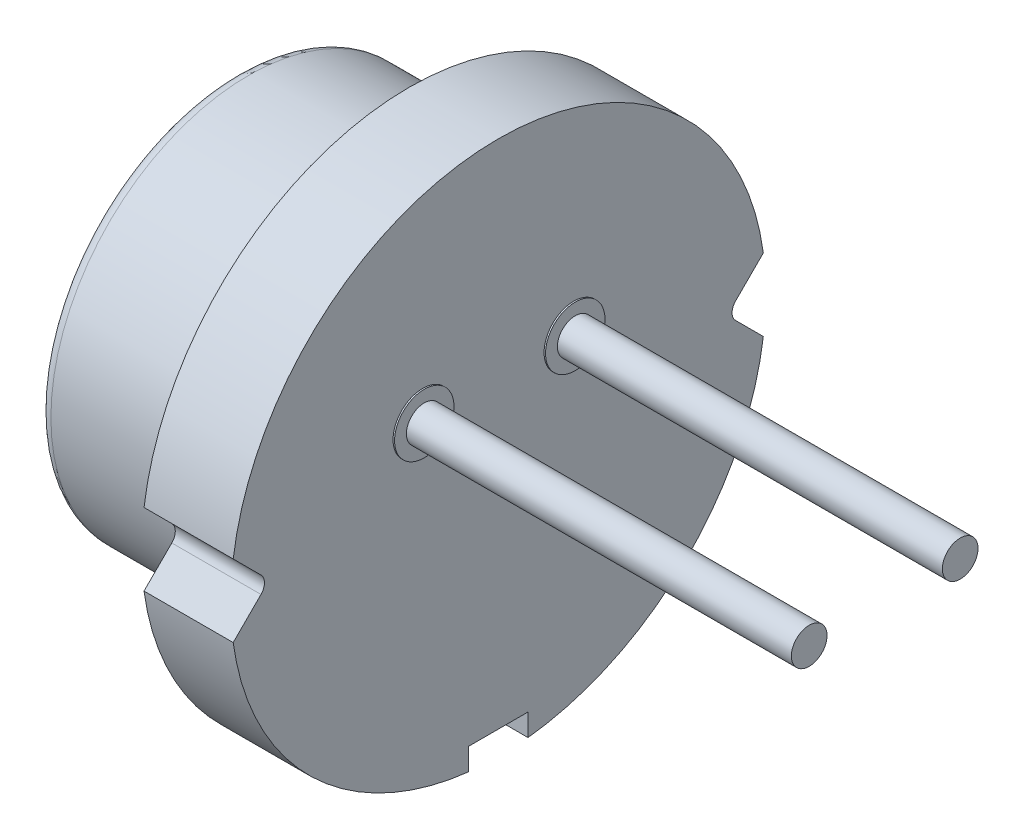
ISO-10303-21;
HEADER;
FILE_DESCRIPTION(('STEP AP214'),'2;1');
FILE_NAME('part.step','',(''),(''),'','','');
FILE_SCHEMA(('AUTOMOTIVE_DESIGN { 1 0 10303 214 1 1 1 1 }'));
ENDSEC;
DATA;
#1=APPLICATION_CONTEXT('core data for automotive mechanical design processes');
#2=APPLICATION_PROTOCOL_DEFINITION('international standard','automotive_design',2000,#1);
#3=PRODUCT_CONTEXT('',#1,'mechanical');
#4=PRODUCT('Part','Part','',(#3));
#5=PRODUCT_RELATED_PRODUCT_CATEGORY('part','',(#4));
#6=PRODUCT_DEFINITION_FORMATION('','',#4);
#7=PRODUCT_DEFINITION_CONTEXT('part definition',#1,'design');
#8=PRODUCT_DEFINITION('design','',#6,#7);
#9=PRODUCT_DEFINITION_SHAPE('','',#8);
#10=(LENGTH_UNIT() NAMED_UNIT(*) SI_UNIT(.MILLI.,.METRE.));
#11=(NAMED_UNIT(*) PLANE_ANGLE_UNIT() SI_UNIT($,.RADIAN.));
#12=(NAMED_UNIT(*) SI_UNIT($,.STERADIAN.) SOLID_ANGLE_UNIT());
#13=UNCERTAINTY_MEASURE_WITH_UNIT(LENGTH_MEASURE(1.E-05),#10,'distance_accuracy_value','');
#14=(GEOMETRIC_REPRESENTATION_CONTEXT(3) GLOBAL_UNCERTAINTY_ASSIGNED_CONTEXT((#13)) GLOBAL_UNIT_ASSIGNED_CONTEXT((#10,
#11,#12)) REPRESENTATION_CONTEXT('',''));
#15=CARTESIAN_POINT('',(0.,0.,0.));
#16=DIRECTION('',(0.,0.,1.));
#17=DIRECTION('',(1.,0.,0.));
#18=AXIS2_PLACEMENT_3D('',#15,#16,#17);
#19=CARTESIAN_POINT('',(-0.46,0.,-0.5));
#20=DIRECTION('',(0.,0.,-1.));
#21=DIRECTION('',(-1.,0.,0.));
#22=AXIS2_PLACEMENT_3D('',#19,#20,#21);
#23=PLANE('',#22);
#24=DIRECTION('',(0.,-1.,0.));
#25=VECTOR('',#24,1.);
#26=CARTESIAN_POINT('',(-1.96,0.,-0.5));
#27=LINE('',#26,#25);
#28=CARTESIAN_POINT('',(-1.96,0.,-0.5));
#29=VERTEX_POINT('',#28);
#30=CARTESIAN_POINT('',(-1.96,-0.1,-0.5));
#31=VERTEX_POINT('',#30);
#32=EDGE_CURVE('E109',#29,#31,#27,.T.);
#33=ORIENTED_EDGE('',*,*,#32,.F.);
#34=DIRECTION('',(-1.,0.,0.));
#35=VECTOR('',#34,1.);
#36=CARTESIAN_POINT('',(-0.46,0.,-0.5));
#37=LINE('',#36,#35);
#38=CARTESIAN_POINT('',(-0.46,0.,-0.5));
#39=VERTEX_POINT('',#38);
#40=EDGE_CURVE('E12',#39,#29,#37,.T.);
#41=ORIENTED_EDGE('',*,*,#40,.F.);
#42=DIRECTION('',(0.,-1.,0.));
#43=VECTOR('',#42,1.);
#44=CARTESIAN_POINT('',(-0.46,0.,-0.5));
#45=LINE('',#44,#43);
#46=CARTESIAN_POINT('',(-0.46,-0.1,-0.5));
#47=VERTEX_POINT('',#46);
#48=EDGE_CURVE('E103',#39,#47,#45,.T.);
#49=ORIENTED_EDGE('',*,*,#48,.T.);
#50=DIRECTION('',(-1.,0.,0.));
#51=VECTOR('',#50,1.);
#52=CARTESIAN_POINT('',(-0.46,-0.1,-0.5));
#53=LINE('',#52,#51);
#54=EDGE_CURVE('E48',#47,#31,#53,.T.);
#55=ORIENTED_EDGE('',*,*,#54,.T.);
#56=EDGE_LOOP('',(#33,#41,#49,#55));
#57=FACE_BOUND('',#56,.T.);
#58=ADVANCED_FACE('F45',(#57),#23,.T.);
#59=CARTESIAN_POINT('',(-0.46,0.,-0.5));
#60=DIRECTION('',(0.,1.,0.));
#61=DIRECTION('',(0.,0.,1.));
#62=AXIS2_PLACEMENT_3D('',#59,#60,#61);
#63=PLANE('',#62);
#64=DIRECTION('',(0.,0.,-1.));
#65=VECTOR('',#64,1.);
#66=CARTESIAN_POINT('',(-1.96,0.,-0.5));
#67=LINE('',#66,#65);
#68=CARTESIAN_POINT('',(-1.96,0.,0.5));
#69=VERTEX_POINT('',#68);
#70=EDGE_CURVE('E105',#69,#29,#67,.T.);
#71=ORIENTED_EDGE('',*,*,#70,.F.);
#72=DIRECTION('',(-1.,0.,0.));
#73=VECTOR('',#72,1.);
#74=CARTESIAN_POINT('',(-0.46,0.,0.5));
#75=LINE('',#74,#73);
#76=CARTESIAN_POINT('',(-0.46,0.,0.5));
#77=VERTEX_POINT('',#76);
#78=EDGE_CURVE('E54',#77,#69,#75,.T.);
#79=ORIENTED_EDGE('',*,*,#78,.F.);
#80=DIRECTION('',(0.,0.,-1.));
#81=VECTOR('',#80,1.);
#82=CARTESIAN_POINT('',(-0.46,0.,-0.5));
#83=LINE('',#82,#81);
#84=EDGE_CURVE('E100',#77,#39,#83,.T.);
#85=ORIENTED_EDGE('',*,*,#84,.T.);
#86=ORIENTED_EDGE('',*,*,#40,.T.);
#87=EDGE_LOOP('',(#71,#79,#85,#86));
#88=FACE_BOUND('',#87,.T.);
#89=ADVANCED_FACE('F119',(#88),#63,.T.);
#90=CARTESIAN_POINT('',(-0.46,0.,0.5));
#91=DIRECTION('',(0.,0.,1.));
#92=DIRECTION('',(1.,0.,0.));
#93=AXIS2_PLACEMENT_3D('',#90,#91,#92);
#94=PLANE('',#93);
#95=DIRECTION('',(0.,1.,0.));
#96=VECTOR('',#95,1.);
#97=CARTESIAN_POINT('',(-1.96,0.,0.5));
#98=LINE('',#97,#96);
#99=CARTESIAN_POINT('',(-1.96,-0.1,0.5));
#100=VERTEX_POINT('',#99);
#101=EDGE_CURVE('E95',#100,#69,#98,.T.);
#102=ORIENTED_EDGE('',*,*,#101,.F.);
#103=DIRECTION('',(-1.,0.,0.));
#104=VECTOR('',#103,1.);
#105=CARTESIAN_POINT('',(-0.46,-0.1,0.5));
#106=LINE('',#105,#104);
#107=CARTESIAN_POINT('',(-0.46,-0.1,0.5));
#108=VERTEX_POINT('',#107);
#109=EDGE_CURVE('E90',#108,#100,#106,.T.);
#110=ORIENTED_EDGE('',*,*,#109,.F.);
#111=DIRECTION('',(0.,1.,0.));
#112=VECTOR('',#111,1.);
#113=CARTESIAN_POINT('',(-0.46,0.,0.5));
#114=LINE('',#113,#112);
#115=EDGE_CURVE('E93',#108,#77,#114,.T.);
#116=ORIENTED_EDGE('',*,*,#115,.T.);
#117=ORIENTED_EDGE('',*,*,#78,.T.);
#118=EDGE_LOOP('',(#102,#110,#116,#117));
#119=FACE_BOUND('',#118,.T.);
#120=ADVANCED_FACE('F92',(#119),#94,.T.);
#121=CARTESIAN_POINT('',(-0.46,-0.1,0.5));
#122=DIRECTION('',(0.,-1.,0.));
#123=DIRECTION('',(0.,0.,-1.));
#124=AXIS2_PLACEMENT_3D('',#121,#122,#123);
#125=PLANE('',#124);
#126=DIRECTION('',(0.,0.,1.));
#127=VECTOR('',#126,1.);
#128=CARTESIAN_POINT('',(-1.96,-0.1,0.5));
#129=LINE('',#128,#127);
#130=EDGE_CURVE('E112',#31,#100,#129,.T.);
#131=ORIENTED_EDGE('',*,*,#130,.F.);
#132=ORIENTED_EDGE('',*,*,#54,.F.);
#133=DIRECTION('',(0.,0.,1.));
#134=VECTOR('',#133,1.);
#135=CARTESIAN_POINT('',(-0.46,-0.1,0.5));
#136=LINE('',#135,#134);
#137=EDGE_CURVE('E99',#47,#108,#136,.T.);
#138=ORIENTED_EDGE('',*,*,#137,.T.);
#139=ORIENTED_EDGE('',*,*,#109,.T.);
#140=EDGE_LOOP('',(#131,#132,#138,#139));
#141=FACE_BOUND('',#140,.T.);
#142=ADVANCED_FACE('F102',(#141),#125,.T.);
#143=CARTESIAN_POINT('',(-0.46,0.,0.));
#144=DIRECTION('',(1.,0.,0.));
#145=DIRECTION('',(0.,0.,-1.));
#146=AXIS2_PLACEMENT_3D('',#143,#144,#145);
#147=PLANE('',#146);
#148=ORIENTED_EDGE('',*,*,#48,.F.);
#149=ORIENTED_EDGE('',*,*,#84,.F.);
#150=ORIENTED_EDGE('',*,*,#115,.F.);
#151=ORIENTED_EDGE('',*,*,#137,.F.);
#152=EDGE_LOOP('',(#148,#149,#150,#151));
#153=FACE_BOUND('',#152,.T.);
#154=ADVANCED_FACE('F98',(#153),#147,.T.);
#155=CARTESIAN_POINT('',(-1.96,0.,0.));
#156=DIRECTION('',(1.,0.,0.));
#157=DIRECTION('',(0.,0.,-1.));
#158=AXIS2_PLACEMENT_3D('',#155,#156,#157);
#159=PLANE('',#158);
#160=ORIENTED_EDGE('',*,*,#32,.T.);
#161=ORIENTED_EDGE('',*,*,#130,.T.);
#162=ORIENTED_EDGE('',*,*,#101,.T.);
#163=ORIENTED_EDGE('',*,*,#70,.T.);
#164=EDGE_LOOP('',(#160,#161,#162,#163));
#165=FACE_BOUND('',#164,.T.);
#166=ADVANCED_FACE('F118',(#165),#159,.F.);
#167=CLOSED_SHELL('',(#58,#89,#120,#142,#154,#166));
#168=MANIFOLD_SOLID_BREP('B2',#167);
#169=CARTESIAN_POINT('',(1.475,1.,-1.27));
#170=DIRECTION('',(1.,0.,0.));
#171=DIRECTION('',(0.,0.,-1.));
#172=AXIS2_PLACEMENT_3D('',#169,#170,#171);
#173=CYLINDRICAL_SURFACE('',#172,0.5);
#174=CARTESIAN_POINT('',(1.475,1.,-1.27));
#175=DIRECTION('',(1.,0.,0.));
#176=DIRECTION('',(0.,0.,-1.));
#177=AXIS2_PLACEMENT_3D('',#174,#175,#176);
#178=CIRCLE('',#177,0.5);
#179=CARTESIAN_POINT('',(1.475,1.,-1.77));
#180=VERTEX_POINT('',#179);
#181=EDGE_CURVE('E44',#180,#180,#178,.T.);
#182=ORIENTED_EDGE('',*,*,#181,.T.);
#183=EDGE_LOOP('',(#182));
#184=FACE_BOUND('',#183,.T.);
#185=CARTESIAN_POINT('',(1.525,1.,-1.27));
#186=DIRECTION('',(1.,0.,0.));
#187=DIRECTION('',(0.,0.,-1.));
#188=AXIS2_PLACEMENT_3D('',#185,#186,#187);
#189=CIRCLE('',#188,0.5);
#190=CARTESIAN_POINT('',(1.525,1.,-1.77));
#191=VERTEX_POINT('',#190);
#192=EDGE_CURVE('E179',#191,#191,#189,.T.);
#193=ORIENTED_EDGE('',*,*,#192,.F.);
#194=EDGE_LOOP('',(#193));
#195=FACE_BOUND('',#194,.T.);
#196=ADVANCED_FACE('F176',(#184,#195),#173,.T.);
#197=CARTESIAN_POINT('',(1.475,1.,-1.27));
#198=DIRECTION('',(1.,0.,0.));
#199=DIRECTION('',(0.,0.,-1.));
#200=AXIS2_PLACEMENT_3D('',#197,#198,#199);
#201=PLANE('',#200);
#202=CARTESIAN_POINT('',(1.475,1.,-1.27));
#203=DIRECTION('',(1.,0.,0.));
#204=DIRECTION('',(0.,0.,-1.));
#205=AXIS2_PLACEMENT_3D('',#202,#203,#204);
#206=CIRCLE('',#205,0.3);
#207=CARTESIAN_POINT('',(1.475,1.,-1.57));
#208=VERTEX_POINT('',#207);
#209=EDGE_CURVE('E186',#208,#208,#206,.T.);
#210=ORIENTED_EDGE('',*,*,#209,.T.);
#211=EDGE_LOOP('',(#210));
#212=FACE_BOUND('',#211,.T.);
#213=ORIENTED_EDGE('',*,*,#181,.F.);
#214=EDGE_LOOP('',(#213));
#215=FACE_BOUND('',#214,.T.);
#216=ADVANCED_FACE('F194',(#212,#215),#201,.F.);
#217=CARTESIAN_POINT('',(1.525,1.,-1.27));
#218=DIRECTION('',(1.,0.,0.));
#219=DIRECTION('',(0.,0.,-1.));
#220=AXIS2_PLACEMENT_3D('',#217,#218,#219);
#221=PLANE('',#220);
#222=CARTESIAN_POINT('',(1.525,1.,-1.27));
#223=DIRECTION('',(1.,0.,0.));
#224=DIRECTION('',(0.,0.,-1.));
#225=AXIS2_PLACEMENT_3D('',#222,#223,#224);
#226=CIRCLE('',#225,0.3);
#227=CARTESIAN_POINT('',(1.525,1.,-1.57));
#228=VERTEX_POINT('',#227);
#229=EDGE_CURVE('E188',#228,#228,#226,.T.);
#230=ORIENTED_EDGE('',*,*,#229,.F.);
#231=EDGE_LOOP('',(#230));
#232=FACE_BOUND('',#231,.T.);
#233=ORIENTED_EDGE('',*,*,#192,.T.);
#234=EDGE_LOOP('',(#233));
#235=FACE_BOUND('',#234,.T.);
#236=ADVANCED_FACE('F200',(#232,#235),#221,.T.);
#237=CARTESIAN_POINT('',(1.475,1.,-1.27));
#238=DIRECTION('',(1.,0.,0.));
#239=DIRECTION('',(0.,0.,-1.));
#240=AXIS2_PLACEMENT_3D('',#237,#238,#239);
#241=CYLINDRICAL_SURFACE('',#240,0.3);
#242=ORIENTED_EDGE('',*,*,#209,.F.);
#243=EDGE_LOOP('',(#242));
#244=FACE_BOUND('',#243,.T.);
#245=ORIENTED_EDGE('',*,*,#229,.T.);
#246=EDGE_LOOP('',(#245));
#247=FACE_BOUND('',#246,.T.);
#248=ADVANCED_FACE('F197',(#244,#247),#241,.F.);
#249=CLOSED_SHELL('',(#196,#216,#236,#248));
#250=MANIFOLD_SOLID_BREP('B6',#249);
#251=CARTESIAN_POINT('',(1.475,1.,1.27));
#252=DIRECTION('',(1.,0.,0.));
#253=DIRECTION('',(0.,0.,-1.));
#254=AXIS2_PLACEMENT_3D('',#251,#252,#253);
#255=CYLINDRICAL_SURFACE('',#254,0.5);
#256=CARTESIAN_POINT('',(1.475,1.,1.27));
#257=DIRECTION('',(1.,0.,0.));
#258=DIRECTION('',(0.,0.,-1.));
#259=AXIS2_PLACEMENT_3D('',#256,#257,#258);
#260=CIRCLE('',#259,0.5);
#261=CARTESIAN_POINT('',(1.475,1.,0.77));
#262=VERTEX_POINT('',#261);
#263=EDGE_CURVE('E175',#262,#262,#260,.T.);
#264=ORIENTED_EDGE('',*,*,#263,.T.);
#265=EDGE_LOOP('',(#264));
#266=FACE_BOUND('',#265,.T.);
#267=CARTESIAN_POINT('',(1.525,1.,1.27));
#268=DIRECTION('',(1.,0.,0.));
#269=DIRECTION('',(0.,0.,-1.));
#270=AXIS2_PLACEMENT_3D('',#267,#268,#269);
#271=CIRCLE('',#270,0.5);
#272=CARTESIAN_POINT('',(1.525,1.,0.77));
#273=VERTEX_POINT('',#272);
#274=EDGE_CURVE('E248',#273,#273,#271,.T.);
#275=ORIENTED_EDGE('',*,*,#274,.F.);
#276=EDGE_LOOP('',(#275));
#277=FACE_BOUND('',#276,.T.);
#278=ADVANCED_FACE('F245',(#266,#277),#255,.T.);
#279=CARTESIAN_POINT('',(1.475,1.,1.27));
#280=DIRECTION('',(1.,0.,0.));
#281=DIRECTION('',(0.,0.,-1.));
#282=AXIS2_PLACEMENT_3D('',#279,#280,#281);
#283=PLANE('',#282);
#284=CARTESIAN_POINT('',(1.475,1.,1.27));
#285=DIRECTION('',(1.,0.,0.));
#286=DIRECTION('',(0.,0.,-1.));
#287=AXIS2_PLACEMENT_3D('',#284,#285,#286);
#288=CIRCLE('',#287,0.3);
#289=CARTESIAN_POINT('',(1.475,1.,0.97));
#290=VERTEX_POINT('',#289);
#291=EDGE_CURVE('E255',#290,#290,#288,.T.);
#292=ORIENTED_EDGE('',*,*,#291,.T.);
#293=EDGE_LOOP('',(#292));
#294=FACE_BOUND('',#293,.T.);
#295=ORIENTED_EDGE('',*,*,#263,.F.);
#296=EDGE_LOOP('',(#295));
#297=FACE_BOUND('',#296,.T.);
#298=ADVANCED_FACE('F263',(#294,#297),#283,.F.);
#299=CARTESIAN_POINT('',(1.525,1.,1.27));
#300=DIRECTION('',(1.,0.,0.));
#301=DIRECTION('',(0.,0.,-1.));
#302=AXIS2_PLACEMENT_3D('',#299,#300,#301);
#303=PLANE('',#302);
#304=CARTESIAN_POINT('',(1.525,1.,1.27));
#305=DIRECTION('',(1.,0.,0.));
#306=DIRECTION('',(0.,0.,-1.));
#307=AXIS2_PLACEMENT_3D('',#304,#305,#306);
#308=CIRCLE('',#307,0.3);
#309=CARTESIAN_POINT('',(1.525,1.,0.97));
#310=VERTEX_POINT('',#309);
#311=EDGE_CURVE('E257',#310,#310,#308,.T.);
#312=ORIENTED_EDGE('',*,*,#311,.F.);
#313=EDGE_LOOP('',(#312));
#314=FACE_BOUND('',#313,.T.);
#315=ORIENTED_EDGE('',*,*,#274,.T.);
#316=EDGE_LOOP('',(#315));
#317=FACE_BOUND('',#316,.T.);
#318=ADVANCED_FACE('F269',(#314,#317),#303,.T.);
#319=CARTESIAN_POINT('',(1.475,1.,1.27));
#320=DIRECTION('',(1.,0.,0.));
#321=DIRECTION('',(0.,0.,-1.));
#322=AXIS2_PLACEMENT_3D('',#319,#320,#321);
#323=CYLINDRICAL_SURFACE('',#322,0.3);
#324=ORIENTED_EDGE('',*,*,#291,.F.);
#325=EDGE_LOOP('',(#324));
#326=FACE_BOUND('',#325,.T.);
#327=ORIENTED_EDGE('',*,*,#311,.T.);
#328=EDGE_LOOP('',(#327));
#329=FACE_BOUND('',#328,.T.);
#330=ADVANCED_FACE('F266',(#326,#329),#323,.F.);
#331=CLOSED_SHELL('',(#278,#298,#318,#330));
#332=MANIFOLD_SOLID_BREP('B39',#331);
#333=CARTESIAN_POINT('',(-2.49171245983604,0.,0.));
#334=DIRECTION('',(-1.,0.,0.));
#335=DIRECTION('',(0.,0.,1.));
#336=AXIS2_PLACEMENT_3D('',#333,#334,#335);
#337=CYLINDRICAL_SURFACE('',#336,3.125);
#338=CARTESIAN_POINT('',(-0.541893017764334,0.,0.));
#339=DIRECTION('',(-1.,0.,0.));
#340=DIRECTION('',(0.,0.,1.));
#341=AXIS2_PLACEMENT_3D('',#338,#339,#340);
#342=CIRCLE('',#341,3.125);
#343=CARTESIAN_POINT('',(-0.541893017764334,0.,3.125));
#344=VERTEX_POINT('',#343);
#345=EDGE_CURVE('E326',#344,#344,#342,.T.);
#346=ORIENTED_EDGE('',*,*,#345,.F.);
#347=EDGE_LOOP('',(#346));
#348=FACE_BOUND('',#347,.T.);
#349=CARTESIAN_POINT('',(-2.7,0.,0.));
#350=DIRECTION('',(-1.,0.,0.));
#351=DIRECTION('',(0.,0.,1.));
#352=AXIS2_PLACEMENT_3D('',#349,#350,#351);
#353=CIRCLE('',#352,3.125);
#354=CARTESIAN_POINT('',(-2.7,0.,3.125));
#355=VERTEX_POINT('',#354);
#356=EDGE_CURVE('E356',#355,#355,#353,.T.);
#357=ORIENTED_EDGE('',*,*,#356,.T.);
#358=EDGE_LOOP('',(#357));
#359=FACE_BOUND('',#358,.T.);
#360=ADVANCED_FACE('F315',(#348,#359),#337,.F.);
#361=CARTESIAN_POINT('',(-0.541893017764335,0.,0.));
#362=DIRECTION('',(-1.,0.,0.));
#363=DIRECTION('',(0.,0.,1.));
#364=AXIS2_PLACEMENT_3D('',#361,#362,#363);
#365=TOROIDAL_SURFACE('',#364,3.90466681152649,0.779666811526495);
#366=CARTESIAN_POINT('',(-0.0275652351110064,0.,0.));
#367=DIRECTION('',(-1.,0.,0.));
#368=DIRECTION('',(0.,0.,1.));
#369=AXIS2_PLACEMENT_3D('',#366,#367,#368);
#370=CIRCLE('',#369,3.31870839236452);
#371=CARTESIAN_POINT('',(-0.0275652351110064,0.,3.31870839236452));
#372=VERTEX_POINT('',#371);
#373=EDGE_CURVE('E330',#372,#372,#370,.T.);
#374=ORIENTED_EDGE('',*,*,#373,.F.);
#375=EDGE_LOOP('',(#374));
#376=FACE_BOUND('',#375,.T.);
#377=ORIENTED_EDGE('',*,*,#345,.T.);
#378=EDGE_LOOP('',(#377));
#379=FACE_BOUND('',#378,.T.);
#380=ADVANCED_FACE('F383',(#376,#379),#365,.T.);
#381=CARTESIAN_POINT('',(-2.49171245983604,0.,0.));
#382=DIRECTION('',(-1.,0.,0.));
#383=DIRECTION('',(0.,0.,1.));
#384=AXIS2_PLACEMENT_3D('',#381,#382,#383);
#385=CYLINDRICAL_SURFACE('',#384,3.31870839236452);
#386=CARTESIAN_POINT('',(0.,0.,0.));
#387=DIRECTION('',(-1.,0.,0.));
#388=DIRECTION('',(0.,0.,1.));
#389=AXIS2_PLACEMENT_3D('',#386,#387,#388);
#390=CIRCLE('',#389,3.31870839236452);
#391=CARTESIAN_POINT('',(0.,0.,3.31870839236452));
#392=VERTEX_POINT('',#391);
#393=EDGE_CURVE('E335',#392,#392,#390,.T.);
#394=ORIENTED_EDGE('',*,*,#393,.F.);
#395=EDGE_LOOP('',(#394));
#396=FACE_BOUND('',#395,.T.);
#397=ORIENTED_EDGE('',*,*,#373,.T.);
#398=EDGE_LOOP('',(#397));
#399=FACE_BOUND('',#398,.T.);
#400=ADVANCED_FACE('F388',(#396,#399),#385,.F.);
#401=CARTESIAN_POINT('',(0.,0.,0.));
#402=DIRECTION('',(1.,0.,0.));
#403=DIRECTION('',(0.,0.,-1.));
#404=AXIS2_PLACEMENT_3D('',#401,#402,#403);
#405=PLANE('',#404);
#406=ORIENTED_EDGE('',*,*,#393,.T.);
#407=EDGE_LOOP('',(#406));
#408=FACE_BOUND('',#407,.T.);
#409=CARTESIAN_POINT('',(0.,0.,0.));
#410=DIRECTION('',(-1.,0.,0.));
#411=DIRECTION('',(0.,0.,1.));
#412=AXIS2_PLACEMENT_3D('',#409,#410,#411);
#413=CIRCLE('',#412,3.65);
#414=CARTESIAN_POINT('',(0.,0.,3.65));
#415=VERTEX_POINT('',#414);
#416=EDGE_CURVE('E338',#415,#415,#413,.T.);
#417=ORIENTED_EDGE('',*,*,#416,.F.);
#418=EDGE_LOOP('',(#417));
#419=FACE_BOUND('',#418,.T.);
#420=ADVANCED_FACE('F395',(#408,#419),#405,.T.);
#421=CARTESIAN_POINT('',(-2.49171245983604,0.,0.));
#422=DIRECTION('',(-1.,0.,0.));
#423=DIRECTION('',(0.,0.,1.));
#424=AXIS2_PLACEMENT_3D('',#421,#422,#423);
#425=CYLINDRICAL_SURFACE('',#424,3.65);
#426=CARTESIAN_POINT('',(-0.200000000000001,0.,0.));
#427=DIRECTION('',(-1.,0.,0.));
#428=DIRECTION('',(0.,0.,1.));
#429=AXIS2_PLACEMENT_3D('',#426,#427,#428);
#430=CIRCLE('',#429,3.65);
#431=CARTESIAN_POINT('',(-0.200000000000001,0.,3.65));
#432=VERTEX_POINT('',#431);
#433=EDGE_CURVE('E341',#432,#432,#430,.T.);
#434=ORIENTED_EDGE('',*,*,#433,.F.);
#435=EDGE_LOOP('',(#434));
#436=FACE_BOUND('',#435,.T.);
#437=ORIENTED_EDGE('',*,*,#416,.T.);
#438=EDGE_LOOP('',(#437));
#439=FACE_BOUND('',#438,.T.);
#440=ADVANCED_FACE('F399',(#436,#439),#425,.T.);
#441=CARTESIAN_POINT('',(-0.200000000000001,0.,0.));
#442=DIRECTION('',(1.,0.,0.));
#443=DIRECTION('',(0.,0.,-1.));
#444=AXIS2_PLACEMENT_3D('',#441,#442,#443);
#445=PLANE('',#444);
#446=CARTESIAN_POINT('',(-0.200000000000001,0.,0.));
#447=DIRECTION('',(-1.,0.,0.));
#448=DIRECTION('',(0.,0.,1.));
#449=AXIS2_PLACEMENT_3D('',#446,#447,#448);
#450=CIRCLE('',#449,3.575);
#451=CARTESIAN_POINT('',(-0.200000000000001,0.,3.575));
#452=VERTEX_POINT('',#451);
#453=EDGE_CURVE('E344',#452,#452,#450,.T.);
#454=ORIENTED_EDGE('',*,*,#453,.F.);
#455=EDGE_LOOP('',(#454));
#456=FACE_BOUND('',#455,.T.);
#457=ORIENTED_EDGE('',*,*,#433,.T.);
#458=EDGE_LOOP('',(#457));
#459=FACE_BOUND('',#458,.T.);
#460=ADVANCED_FACE('F403',(#456,#459),#445,.F.);
#461=CARTESIAN_POINT('',(-0.450000000000001,0.,0.));
#462=DIRECTION('',(-1.,0.,0.));
#463=DIRECTION('',(0.,0.,1.));
#464=AXIS2_PLACEMENT_3D('',#461,#462,#463);
#465=TOROIDAL_SURFACE('',#464,3.575,0.25);
#466=CARTESIAN_POINT('',(-0.450000000000001,0.,0.));
#467=DIRECTION('',(-1.,0.,0.));
#468=DIRECTION('',(0.,0.,1.));
#469=AXIS2_PLACEMENT_3D('',#466,#467,#468);
#470=CIRCLE('',#469,3.325);
#471=CARTESIAN_POINT('',(-0.450000000000001,0.,3.325));
#472=VERTEX_POINT('',#471);
#473=EDGE_CURVE('E347',#472,#472,#470,.T.);
#474=ORIENTED_EDGE('',*,*,#473,.F.);
#475=EDGE_LOOP('',(#474));
#476=FACE_BOUND('',#475,.T.);
#477=ORIENTED_EDGE('',*,*,#453,.T.);
#478=EDGE_LOOP('',(#477));
#479=FACE_BOUND('',#478,.T.);
#480=ADVANCED_FACE('F380',(#476,#479),#465,.F.);
#481=CARTESIAN_POINT('',(-2.49171245983604,0.,0.));
#482=DIRECTION('',(-1.,0.,0.));
#483=DIRECTION('',(0.,0.,1.));
#484=AXIS2_PLACEMENT_3D('',#481,#482,#483);
#485=CYLINDRICAL_SURFACE('',#484,3.325);
#486=CARTESIAN_POINT('',(-2.7,0.,0.));
#487=DIRECTION('',(-1.,0.,0.));
#488=DIRECTION('',(0.,0.,1.));
#489=AXIS2_PLACEMENT_3D('',#486,#487,#488);
#490=CIRCLE('',#489,3.325);
#491=CARTESIAN_POINT('',(-2.7,0.,3.325));
#492=VERTEX_POINT('',#491);
#493=EDGE_CURVE('E244',#492,#492,#490,.F.);
#494=ORIENTED_EDGE('',*,*,#493,.T.);
#495=EDGE_LOOP('',(#494));
#496=FACE_BOUND('',#495,.T.);
#497=ORIENTED_EDGE('',*,*,#473,.T.);
#498=EDGE_LOOP('',(#497));
#499=FACE_BOUND('',#498,.T.);
#500=ADVANCED_FACE('F375',(#496,#499),#485,.T.);
#501=CARTESIAN_POINT('',(-2.9,0.,0.));
#502=DIRECTION('',(-1.,0.,0.));
#503=DIRECTION('',(0.,0.,1.));
#504=AXIS2_PLACEMENT_3D('',#501,#502,#503);
#505=PLANE('',#504);
#506=CARTESIAN_POINT('',(-2.9,0.,0.));
#507=DIRECTION('',(-1.,0.,0.));
#508=DIRECTION('',(0.,0.,1.));
#509=AXIS2_PLACEMENT_3D('',#506,#507,#508);
#510=CIRCLE('',#509,3.125);
#511=CARTESIAN_POINT('',(-2.9,0.,3.125));
#512=VERTEX_POINT('',#511);
#513=EDGE_CURVE('E322',#512,#512,#510,.T.);
#514=ORIENTED_EDGE('',*,*,#513,.T.);
#515=EDGE_LOOP('',(#514));
#516=FACE_BOUND('',#515,.T.);
#517=CARTESIAN_POINT('',(-2.9,0.,0.));
#518=DIRECTION('',(-1.,0.,0.));
#519=DIRECTION('',(0.,0.,1.));
#520=AXIS2_PLACEMENT_3D('',#517,#518,#519);
#521=CIRCLE('',#520,0.75);
#522=CARTESIAN_POINT('',(-2.9,0.,0.75));
#523=VERTEX_POINT('',#522);
#524=EDGE_CURVE('E350',#523,#523,#521,.T.);
#525=ORIENTED_EDGE('',*,*,#524,.F.);
#526=EDGE_LOOP('',(#525));
#527=FACE_BOUND('',#526,.T.);
#528=ADVANCED_FACE('F370',(#516,#527),#505,.T.);
#529=CARTESIAN_POINT('',(-2.49171245983604,0.,0.));
#530=DIRECTION('',(-1.,0.,0.));
#531=DIRECTION('',(0.,0.,1.));
#532=AXIS2_PLACEMENT_3D('',#529,#530,#531);
#533=CYLINDRICAL_SURFACE('',#532,0.75);
#534=CARTESIAN_POINT('',(-2.7,0.,0.));
#535=DIRECTION('',(-1.,0.,0.));
#536=DIRECTION('',(0.,0.,1.));
#537=AXIS2_PLACEMENT_3D('',#534,#535,#536);
#538=CIRCLE('',#537,0.75);
#539=CARTESIAN_POINT('',(-2.7,0.,0.75));
#540=VERTEX_POINT('',#539);
#541=EDGE_CURVE('E353',#540,#540,#538,.T.);
#542=ORIENTED_EDGE('',*,*,#541,.F.);
#543=EDGE_LOOP('',(#542));
#544=FACE_BOUND('',#543,.T.);
#545=ORIENTED_EDGE('',*,*,#524,.T.);
#546=EDGE_LOOP('',(#545));
#547=FACE_BOUND('',#546,.T.);
#548=ADVANCED_FACE('F364',(#544,#547),#533,.F.);
#549=CARTESIAN_POINT('',(-2.7,0.,0.));
#550=DIRECTION('',(-1.,0.,0.));
#551=DIRECTION('',(0.,0.,1.));
#552=AXIS2_PLACEMENT_3D('',#549,#550,#551);
#553=PLANE('',#552);
#554=ORIENTED_EDGE('',*,*,#356,.F.);
#555=EDGE_LOOP('',(#554));
#556=FACE_BOUND('',#555,.T.);
#557=ORIENTED_EDGE('',*,*,#541,.T.);
#558=EDGE_LOOP('',(#557));
#559=FACE_BOUND('',#558,.T.);
#560=ADVANCED_FACE('F361',(#556,#559),#553,.F.);
#561=CARTESIAN_POINT('',(-2.7,0.,0.));
#562=DIRECTION('',(-1.,0.,0.));
#563=DIRECTION('',(0.,0.,1.));
#564=AXIS2_PLACEMENT_3D('',#561,#562,#563);
#565=TOROIDAL_SURFACE('',#564,3.125,0.2);
#566=ORIENTED_EDGE('',*,*,#493,.F.);
#567=EDGE_LOOP('',(#566));
#568=FACE_BOUND('',#567,.T.);
#569=ORIENTED_EDGE('',*,*,#513,.F.);
#570=EDGE_LOOP('',(#569));
#571=FACE_BOUND('',#570,.T.);
#572=ADVANCED_FACE('F317',(#568,#571),#565,.T.);
#573=CLOSED_SHELL('',(#360,#380,#400,#420,#440,#460,#480,#500,#528,#548,#560,#572));
#574=MANIFOLD_SOLID_BREP('B170',#573);
#575=CARTESIAN_POINT('',(0.,0.,0.));
#576=DIRECTION('',(1.,0.,0.));
#577=DIRECTION('',(0.,0.,-1.));
#578=AXIS2_PLACEMENT_3D('',#575,#576,#577);
#579=PLANE('',#578);
#580=DIRECTION('',(0.,1.,0.));
#581=VECTOR('',#580,1.);
#582=CARTESIAN_POINT('',(0.,-0.1,2.22715627668659));
#583=LINE('',#582,#581);
#584=CARTESIAN_POINT('',(0.,-1.95888908740472,2.22715627668659));
#585=VERTEX_POINT('',#584);
#586=CARTESIAN_POINT('',(0.,-0.1,2.22715627668659));
#587=VERTEX_POINT('',#586);
#588=EDGE_CURVE('E760',#585,#587,#583,.T.);
#589=ORIENTED_EDGE('',*,*,#588,.F.);
#590=DIRECTION('',(0.,0.,1.));
#591=VECTOR('',#590,1.);
#592=CARTESIAN_POINT('',(0.,-1.95888908740472,2.22715627668659));
#593=LINE('',#592,#591);
#594=CARTESIAN_POINT('',(0.,-1.95888908740472,-2.22715627668659));
#595=VERTEX_POINT('',#594);
#596=EDGE_CURVE('E765',#595,#585,#593,.T.);
#597=ORIENTED_EDGE('',*,*,#596,.F.);
#598=DIRECTION('',(0.,-1.,0.));
#599=VECTOR('',#598,1.);
#600=CARTESIAN_POINT('',(0.,-0.1,-2.22715627668659));
#601=LINE('',#600,#599);
#602=CARTESIAN_POINT('',(0.,-0.1,-2.22715627668659));
#603=VERTEX_POINT('',#602);
#604=EDGE_CURVE('E777',#603,#595,#601,.T.);
#605=ORIENTED_EDGE('',*,*,#604,.F.);
#606=DIRECTION('',(0.,0.,-1.));
#607=VECTOR('',#606,1.);
#608=CARTESIAN_POINT('',(0.,-0.1,-2.22715627668659));
#609=LINE('',#608,#607);
#610=EDGE_CURVE('E774',#587,#603,#609,.T.);
#611=ORIENTED_EDGE('',*,*,#610,.F.);
#612=EDGE_LOOP('',(#589,#597,#605,#611));
#613=FACE_BOUND('',#612,.T.);
#614=DIRECTION('',(0.,-0.707106781186548,0.707106781186547));
#615=VECTOR('',#614,1.);
#616=CARTESIAN_POINT('',(0.,1.925,1.925));
#617=LINE('',#616,#615);
#618=CARTESIAN_POINT('',(0.,-0.141421356237311,3.99142135623731));
#619=VERTEX_POINT('',#618);
#620=CARTESIAN_POINT('',(0.,-0.608648554949958,4.45864855494996));
#621=VERTEX_POINT('',#620);
#622=EDGE_CURVE('E623',#619,#621,#617,.T.);
#623=ORIENTED_EDGE('',*,*,#622,.F.);
#624=CARTESIAN_POINT('',(0.,0.,4.13284271247462));
#625=DIRECTION('',(1.,0.,0.));
#626=DIRECTION('',(0.,0.,-1.));
#627=AXIS2_PLACEMENT_3D('',#624,#625,#626);
#628=CIRCLE('',#627,0.2);
#629=CARTESIAN_POINT('',(0.,0.141421356237309,3.99142135623731));
#630=VERTEX_POINT('',#629);
#631=EDGE_CURVE('E681',#619,#630,#628,.T.);
#632=ORIENTED_EDGE('',*,*,#631,.T.);
#633=DIRECTION('',(0.,0.707106781186549,0.707106781186546));
#634=VECTOR('',#633,1.);
#635=CARTESIAN_POINT('',(0.,-1.925,1.92500000000001));
#636=LINE('',#635,#634);
#637=CARTESIAN_POINT('',(0.,0.608648554949958,4.45864855494995));
#638=VERTEX_POINT('',#637);
#639=EDGE_CURVE('E684',#630,#638,#636,.T.);
#640=ORIENTED_EDGE('',*,*,#639,.T.);
#641=CARTESIAN_POINT('',(0.,0.,0.));
#642=DIRECTION('',(-1.,0.,0.));
#643=DIRECTION('',(0.,0.,1.));
#644=AXIS2_PLACEMENT_3D('',#641,#642,#643);
#645=CIRCLE('',#644,4.5);
#646=CARTESIAN_POINT('',(0.,0.608648554949957,-4.45864855494996));
#647=VERTEX_POINT('',#646);
#648=EDGE_CURVE('E649',#638,#647,#645,.T.);
#649=ORIENTED_EDGE('',*,*,#648,.T.);
#650=DIRECTION('',(0.,0.707106781186548,-0.707106781186547));
#651=VECTOR('',#650,1.);
#652=CARTESIAN_POINT('',(0.,-1.925,-1.925));
#653=LINE('',#652,#651);
#654=CARTESIAN_POINT('',(0.,0.141421356237309,-3.99142135623731));
#655=VERTEX_POINT('',#654);
#656=EDGE_CURVE('E750',#655,#647,#653,.T.);
#657=ORIENTED_EDGE('',*,*,#656,.F.);
#658=CARTESIAN_POINT('',(0.,0.,-4.13284271247462));
#659=DIRECTION('',(1.,0.,0.));
#660=DIRECTION('',(0.,0.,-1.));
#661=AXIS2_PLACEMENT_3D('',#658,#659,#660);
#662=CIRCLE('',#661,0.2);
#663=CARTESIAN_POINT('',(0.,-0.141421356237309,-3.99142135623731));
#664=VERTEX_POINT('',#663);
#665=EDGE_CURVE('E313',#655,#664,#662,.T.);
#666=ORIENTED_EDGE('',*,*,#665,.T.);
#667=DIRECTION('',(0.,-0.707106781186548,-0.707106781186547));
#668=VECTOR('',#667,1.);
#669=CARTESIAN_POINT('',(0.,1.925,-1.925));
#670=LINE('',#669,#668);
#671=CARTESIAN_POINT('',(0.,-0.608648554949957,-4.45864855494996));
#672=VERTEX_POINT('',#671);
#673=EDGE_CURVE('E748',#664,#672,#670,.T.);
#674=ORIENTED_EDGE('',*,*,#673,.T.);
#675=CARTESIAN_POINT('',(0.,-4.47213595499958,-0.500000000000001));
#676=VERTEX_POINT('',#675);
#677=EDGE_CURVE('E648',#672,#676,#645,.T.);
#678=ORIENTED_EDGE('',*,*,#677,.T.);
#679=DIRECTION('',(0.,1.,0.));
#680=VECTOR('',#679,1.);
#681=CARTESIAN_POINT('',(0.,0.,-0.500000000000001));
#682=LINE('',#681,#680);
#683=CARTESIAN_POINT('',(0.,-4.1,-0.500000000000001));
#684=VERTEX_POINT('',#683);
#685=EDGE_CURVE('E752',#676,#684,#682,.T.);
#686=ORIENTED_EDGE('',*,*,#685,.T.);
#687=DIRECTION('',(0.,0.,1.));
#688=VECTOR('',#687,1.);
#689=CARTESIAN_POINT('',(0.,-4.1,0.));
#690=LINE('',#689,#688);
#691=CARTESIAN_POINT('',(0.,-4.1,0.499999999999999));
#692=VERTEX_POINT('',#691);
#693=EDGE_CURVE('E757',#684,#692,#690,.T.);
#694=ORIENTED_EDGE('',*,*,#693,.T.);
#695=DIRECTION('',(0.,1.,0.));
#696=VECTOR('',#695,1.);
#697=CARTESIAN_POINT('',(0.,0.,0.499999999999999));
#698=LINE('',#697,#696);
#699=CARTESIAN_POINT('',(0.,-4.47213595499958,0.499999999999999));
#700=VERTEX_POINT('',#699);
#701=EDGE_CURVE('E690',#700,#692,#698,.T.);
#702=ORIENTED_EDGE('',*,*,#701,.F.);
#703=EDGE_CURVE('E643',#700,#621,#645,.T.);
#704=ORIENTED_EDGE('',*,*,#703,.T.);
#705=EDGE_LOOP('',(#623,#632,#640,#649,#657,#666,#674,#678,#686,#694,#702,#704));
#706=FACE_BOUND('',#705,.T.);
#707=ADVANCED_FACE('F496',(#613,#706),#579,.F.);
#708=CARTESIAN_POINT('',(1.5,0.,0.));
#709=DIRECTION('',(-1.,0.,0.));
#710=DIRECTION('',(0.,0.,1.));
#711=AXIS2_PLACEMENT_3D('',#708,#709,#710);
#712=PLANE('',#711);
#713=CARTESIAN_POINT('',(1.5,1.,1.27));
#714=DIRECTION('',(-1.,0.,0.));
#715=DIRECTION('',(0.,0.,1.));
#716=AXIS2_PLACEMENT_3D('',#713,#714,#715);
#717=CIRCLE('',#716,0.3);
#718=CARTESIAN_POINT('',(1.5,1.,1.57));
#719=VERTEX_POINT('',#718);
#720=EDGE_CURVE('E655',#719,#719,#717,.F.);
#721=ORIENTED_EDGE('',*,*,#720,.F.);
#722=EDGE_LOOP('',(#721));
#723=FACE_BOUND('',#722,.T.);
#724=CARTESIAN_POINT('',(1.5,1.,-1.27));
#725=DIRECTION('',(-1.,0.,0.));
#726=DIRECTION('',(0.,0.,1.));
#727=AXIS2_PLACEMENT_3D('',#724,#725,#726);
#728=CIRCLE('',#727,0.3);
#729=CARTESIAN_POINT('',(1.5,1.,-0.97));
#730=VERTEX_POINT('',#729);
#731=EDGE_CURVE('E639',#730,#730,#728,.T.);
#732=ORIENTED_EDGE('',*,*,#731,.T.);
#733=EDGE_LOOP('',(#732));
#734=FACE_BOUND('',#733,.T.);
#735=DIRECTION('',(0.,0.707106781186549,0.707106781186546));
#736=VECTOR('',#735,1.);
#737=CARTESIAN_POINT('',(1.5,-1.925,1.92500000000001));
#738=LINE('',#737,#736);
#739=CARTESIAN_POINT('',(1.5,0.141421356237309,3.99142135623731));
#740=VERTEX_POINT('',#739);
#741=CARTESIAN_POINT('',(1.5,0.608648554949958,4.45864855494995));
#742=VERTEX_POINT('',#741);
#743=EDGE_CURVE('E616',#740,#742,#738,.T.);
#744=ORIENTED_EDGE('',*,*,#743,.F.);
#745=CARTESIAN_POINT('',(1.5,0.,4.13284271247462));
#746=DIRECTION('',(-1.,0.,0.));
#747=DIRECTION('',(0.,0.,1.));
#748=AXIS2_PLACEMENT_3D('',#745,#746,#747);
#749=CIRCLE('',#748,0.2);
#750=CARTESIAN_POINT('',(1.5,-0.141421356237311,3.99142135623731));
#751=VERTEX_POINT('',#750);
#752=EDGE_CURVE('E613',#740,#751,#749,.T.);
#753=ORIENTED_EDGE('',*,*,#752,.T.);
#754=DIRECTION('',(0.,-0.707106781186548,0.707106781186547));
#755=VECTOR('',#754,1.);
#756=CARTESIAN_POINT('',(1.5,1.925,1.925));
#757=LINE('',#756,#755);
#758=CARTESIAN_POINT('',(1.5,-0.608648554949958,4.45864855494996));
#759=VERTEX_POINT('',#758);
#760=EDGE_CURVE('E606',#751,#759,#757,.T.);
#761=ORIENTED_EDGE('',*,*,#760,.T.);
#762=CARTESIAN_POINT('',(1.5,0.,0.));
#763=DIRECTION('',(-1.,0.,0.));
#764=DIRECTION('',(0.,0.,1.));
#765=AXIS2_PLACEMENT_3D('',#762,#763,#764);
#766=CIRCLE('',#765,4.5);
#767=CARTESIAN_POINT('',(1.5,-4.47213595499958,0.499999999999999));
#768=VERTEX_POINT('',#767);
#769=EDGE_CURVE('E612',#768,#759,#766,.T.);
#770=ORIENTED_EDGE('',*,*,#769,.F.);
#771=DIRECTION('',(0.,1.,0.));
#772=VECTOR('',#771,1.);
#773=CARTESIAN_POINT('',(1.5,0.,0.499999999999999));
#774=LINE('',#773,#772);
#775=CARTESIAN_POINT('',(1.5,-4.1,0.499999999999999));
#776=VERTEX_POINT('',#775);
#777=EDGE_CURVE('E736',#768,#776,#774,.T.);
#778=ORIENTED_EDGE('',*,*,#777,.T.);
#779=DIRECTION('',(0.,0.,1.));
#780=VECTOR('',#779,1.);
#781=CARTESIAN_POINT('',(1.5,-4.1,0.));
#782=LINE('',#781,#780);
#783=CARTESIAN_POINT('',(1.5,-4.1,-0.500000000000001));
#784=VERTEX_POINT('',#783);
#785=EDGE_CURVE('E733',#784,#776,#782,.T.);
#786=ORIENTED_EDGE('',*,*,#785,.F.);
#787=DIRECTION('',(0.,1.,0.));
#788=VECTOR('',#787,1.);
#789=CARTESIAN_POINT('',(1.5,0.,-0.500000000000001));
#790=LINE('',#789,#788);
#791=CARTESIAN_POINT('',(1.5,-4.47213595499958,-0.500000000000001));
#792=VERTEX_POINT('',#791);
#793=EDGE_CURVE('E731',#792,#784,#790,.T.);
#794=ORIENTED_EDGE('',*,*,#793,.F.);
#795=CARTESIAN_POINT('',(1.5,-0.608648554949957,-4.45864855494996));
#796=VERTEX_POINT('',#795);
#797=EDGE_CURVE('E633',#796,#792,#766,.T.);
#798=ORIENTED_EDGE('',*,*,#797,.F.);
#799=DIRECTION('',(0.,-0.707106781186548,-0.707106781186547));
#800=VECTOR('',#799,1.);
#801=CARTESIAN_POINT('',(1.5,1.925,-1.925));
#802=LINE('',#801,#800);
#803=CARTESIAN_POINT('',(1.5,-0.141421356237309,-3.99142135623731));
#804=VERTEX_POINT('',#803);
#805=EDGE_CURVE('E728',#804,#796,#802,.T.);
#806=ORIENTED_EDGE('',*,*,#805,.F.);
#807=CARTESIAN_POINT('',(1.5,0.,-4.13284271247462));
#808=DIRECTION('',(-1.,0.,0.));
#809=DIRECTION('',(0.,0.,1.));
#810=AXIS2_PLACEMENT_3D('',#807,#808,#809);
#811=CIRCLE('',#810,0.2);
#812=CARTESIAN_POINT('',(1.5,0.141421356237309,-3.99142135623731));
#813=VERTEX_POINT('',#812);
#814=EDGE_CURVE('E504',#804,#813,#811,.T.);
#815=ORIENTED_EDGE('',*,*,#814,.T.);
#816=DIRECTION('',(0.,0.707106781186548,-0.707106781186547));
#817=VECTOR('',#816,1.);
#818=CARTESIAN_POINT('',(1.5,-1.925,-1.925));
#819=LINE('',#818,#817);
#820=CARTESIAN_POINT('',(1.5,0.608648554949957,-4.45864855494996));
#821=VERTEX_POINT('',#820);
#822=EDGE_CURVE('E745',#813,#821,#819,.T.);
#823=ORIENTED_EDGE('',*,*,#822,.T.);
#824=EDGE_CURVE('E636',#742,#821,#766,.T.);
#825=ORIENTED_EDGE('',*,*,#824,.F.);
#826=EDGE_LOOP('',(#744,#753,#761,#770,#778,#786,#794,#798,#806,#815,#823,#825));
#827=FACE_BOUND('',#826,.T.);
#828=ADVANCED_FACE('F609',(#723,#734,#827),#712,.F.);
#829=CARTESIAN_POINT('',(-2.49171245983604,0.,0.));
#830=DIRECTION('',(-1.,0.,0.));
#831=DIRECTION('',(0.,0.,1.));
#832=AXIS2_PLACEMENT_3D('',#829,#830,#831);
#833=CYLINDRICAL_SURFACE('',#832,4.5);
#834=DIRECTION('',(-1.,0.,0.));
#835=VECTOR('',#834,1.);
#836=CARTESIAN_POINT('',(-2.49171245983604,-0.608648554949958,4.45864855494996));
#837=LINE('',#836,#835);
#838=EDGE_CURVE('E620',#621,#759,#837,.F.);
#839=ORIENTED_EDGE('',*,*,#838,.F.);
#840=ORIENTED_EDGE('',*,*,#703,.F.);
#841=DIRECTION('',(-1.,0.,0.));
#842=VECTOR('',#841,1.);
#843=CARTESIAN_POINT('',(-2.49171245983604,-4.47213595499958,0.499999999999999));
#844=LINE('',#843,#842);
#845=EDGE_CURVE('E632',#768,#700,#844,.T.);
#846=ORIENTED_EDGE('',*,*,#845,.F.);
#847=ORIENTED_EDGE('',*,*,#769,.T.);
#848=EDGE_LOOP('',(#839,#840,#846,#847));
#849=FACE_BOUND('',#848,.T.);
#850=ADVANCED_FACE('F631',(#849),#833,.T.);
#851=ORIENTED_EDGE('',*,*,#648,.F.);
#852=DIRECTION('',(-1.,0.,0.));
#853=VECTOR('',#852,1.);
#854=CARTESIAN_POINT('',(-2.49171245983604,0.608648554949958,4.45864855494996));
#855=LINE('',#854,#853);
#856=EDGE_CURVE('E628',#638,#742,#855,.F.);
#857=ORIENTED_EDGE('',*,*,#856,.T.);
#858=ORIENTED_EDGE('',*,*,#824,.T.);
#859=DIRECTION('',(-1.,0.,0.));
#860=VECTOR('',#859,1.);
#861=CARTESIAN_POINT('',(-2.49171245983604,0.608648554949957,-4.45864855494996));
#862=LINE('',#861,#860);
#863=EDGE_CURVE('E662',#647,#821,#862,.F.);
#864=ORIENTED_EDGE('',*,*,#863,.F.);
#865=EDGE_LOOP('',(#851,#857,#858,#864));
#866=FACE_BOUND('',#865,.T.);
#867=ADVANCED_FACE('F711',(#866),#833,.T.);
#868=ORIENTED_EDGE('',*,*,#797,.T.);
#869=DIRECTION('',(-1.,0.,0.));
#870=VECTOR('',#869,1.);
#871=CARTESIAN_POINT('',(-2.49171245983604,-4.47213595499958,-0.500000000000001));
#872=LINE('',#871,#870);
#873=EDGE_CURVE('E667',#792,#676,#872,.T.);
#874=ORIENTED_EDGE('',*,*,#873,.T.);
#875=ORIENTED_EDGE('',*,*,#677,.F.);
#876=DIRECTION('',(-1.,0.,0.));
#877=VECTOR('',#876,1.);
#878=CARTESIAN_POINT('',(-2.49171245983604,-0.608648554949957,-4.45864855494996));
#879=LINE('',#878,#877);
#880=EDGE_CURVE('E658',#672,#796,#879,.F.);
#881=ORIENTED_EDGE('',*,*,#880,.T.);
#882=EDGE_LOOP('',(#868,#874,#875,#881));
#883=FACE_BOUND('',#882,.T.);
#884=ADVANCED_FACE('F712',(#883),#833,.T.);
#885=CARTESIAN_POINT('',(8.,1.,1.27));
#886=DIRECTION('',(-1.,0.,0.));
#887=DIRECTION('',(0.,0.,1.));
#888=AXIS2_PLACEMENT_3D('',#885,#886,#887);
#889=CYLINDRICAL_SURFACE('',#888,0.3);
#890=CARTESIAN_POINT('',(8.,1.,1.27));
#891=DIRECTION('',(1.,0.,0.));
#892=DIRECTION('',(0.,0.,-1.));
#893=AXIS2_PLACEMENT_3D('',#890,#891,#892);
#894=CIRCLE('',#893,0.3);
#895=CARTESIAN_POINT('',(8.,1.,0.97));
#896=VERTEX_POINT('',#895);
#897=EDGE_CURVE('E634',#896,#896,#894,.T.);
#898=ORIENTED_EDGE('',*,*,#897,.F.);
#899=EDGE_LOOP('',(#898));
#900=FACE_BOUND('',#899,.T.);
#901=ORIENTED_EDGE('',*,*,#720,.T.);
#902=EDGE_LOOP('',(#901));
#903=FACE_BOUND('',#902,.T.);
#904=ADVANCED_FACE('F717',(#900,#903),#889,.T.);
#905=CARTESIAN_POINT('',(8.,0.,0.));
#906=DIRECTION('',(1.,0.,0.));
#907=DIRECTION('',(0.,0.,-1.));
#908=AXIS2_PLACEMENT_3D('',#905,#906,#907);
#909=PLANE('',#908);
#910=ORIENTED_EDGE('',*,*,#897,.T.);
#911=EDGE_LOOP('',(#910));
#912=FACE_BOUND('',#911,.T.);
#913=ADVANCED_FACE('F722',(#912),#909,.T.);
#914=CARTESIAN_POINT('',(8.,1.,-1.27));
#915=DIRECTION('',(-1.,0.,0.));
#916=DIRECTION('',(0.,0.,1.));
#917=AXIS2_PLACEMENT_3D('',#914,#915,#916);
#918=CYLINDRICAL_SURFACE('',#917,0.3);
#919=CARTESIAN_POINT('',(8.,1.,-1.27));
#920=DIRECTION('',(-1.,0.,0.));
#921=DIRECTION('',(0.,0.,1.));
#922=AXIS2_PLACEMENT_3D('',#919,#920,#921);
#923=CIRCLE('',#922,0.3);
#924=CARTESIAN_POINT('',(8.,1.,-0.97));
#925=VERTEX_POINT('',#924);
#926=EDGE_CURVE('E793',#925,#925,#923,.T.);
#927=ORIENTED_EDGE('',*,*,#926,.T.);
#928=EDGE_LOOP('',(#927));
#929=FACE_BOUND('',#928,.T.);
#930=ORIENTED_EDGE('',*,*,#731,.F.);
#931=EDGE_LOOP('',(#930));
#932=FACE_BOUND('',#931,.T.);
#933=ADVANCED_FACE('F799',(#929,#932),#918,.T.);
#934=CARTESIAN_POINT('',(8.,1.,-1.27));
#935=DIRECTION('',(-1.,0.,0.));
#936=DIRECTION('',(0.,0.,1.));
#937=AXIS2_PLACEMENT_3D('',#934,#935,#936);
#938=PLANE('',#937);
#939=ORIENTED_EDGE('',*,*,#926,.F.);
#940=EDGE_LOOP('',(#939));
#941=FACE_BOUND('',#940,.T.);
#942=ADVANCED_FACE('F802',(#941),#938,.F.);
#943=CARTESIAN_POINT('',(-1.96,-0.1,2.22715627668659));
#944=DIRECTION('',(0.,0.,-1.));
#945=DIRECTION('',(-1.,0.,0.));
#946=AXIS2_PLACEMENT_3D('',#943,#944,#945);
#947=PLANE('',#946);
#948=ORIENTED_EDGE('',*,*,#588,.T.);
#949=DIRECTION('',(1.,0.,0.));
#950=VECTOR('',#949,1.);
#951=CARTESIAN_POINT('',(-1.96,-0.1,2.22715627668659));
#952=LINE('',#951,#950);
#953=CARTESIAN_POINT('',(-1.96,-0.1,2.22715627668659));
#954=VERTEX_POINT('',#953);
#955=EDGE_CURVE('E790',#954,#587,#952,.T.);
#956=ORIENTED_EDGE('',*,*,#955,.F.);
#957=DIRECTION('',(0.,1.,0.));
#958=VECTOR('',#957,1.);
#959=CARTESIAN_POINT('',(-1.96,-0.1,2.22715627668659));
#960=LINE('',#959,#958);
#961=CARTESIAN_POINT('',(-1.96,-1.95888908740472,2.22715627668659));
#962=VERTEX_POINT('',#961);
#963=EDGE_CURVE('E761',#962,#954,#960,.T.);
#964=ORIENTED_EDGE('',*,*,#963,.F.);
#965=DIRECTION('',(1.,0.,0.));
#966=VECTOR('',#965,1.);
#967=CARTESIAN_POINT('',(-1.96,-1.95888908740472,2.22715627668659));
#968=LINE('',#967,#966);
#969=EDGE_CURVE('E771',#962,#585,#968,.T.);
#970=ORIENTED_EDGE('',*,*,#969,.T.);
#971=EDGE_LOOP('',(#948,#956,#964,#970));
#972=FACE_BOUND('',#971,.T.);
#973=ADVANCED_FACE('F804',(#972),#947,.F.);
#974=CARTESIAN_POINT('',(-1.96,-0.1,-2.22715627668659));
#975=DIRECTION('',(0.,-1.,0.));
#976=DIRECTION('',(0.,0.,-1.));
#977=AXIS2_PLACEMENT_3D('',#974,#975,#976);
#978=PLANE('',#977);
#979=ORIENTED_EDGE('',*,*,#610,.T.);
#980=DIRECTION('',(1.,0.,0.));
#981=VECTOR('',#980,1.);
#982=CARTESIAN_POINT('',(-1.96,-0.1,-2.22715627668659));
#983=LINE('',#982,#981);
#984=CARTESIAN_POINT('',(-1.96,-0.1,-2.22715627668659));
#985=VERTEX_POINT('',#984);
#986=EDGE_CURVE('E787',#985,#603,#983,.T.);
#987=ORIENTED_EDGE('',*,*,#986,.F.);
#988=DIRECTION('',(0.,0.,-1.));
#989=VECTOR('',#988,1.);
#990=CARTESIAN_POINT('',(-1.96,-0.1,-2.22715627668659));
#991=LINE('',#990,#989);
#992=EDGE_CURVE('E764',#954,#985,#991,.T.);
#993=ORIENTED_EDGE('',*,*,#992,.F.);
#994=ORIENTED_EDGE('',*,*,#955,.T.);
#995=EDGE_LOOP('',(#979,#987,#993,#994));
#996=FACE_BOUND('',#995,.T.);
#997=ADVANCED_FACE('F810',(#996),#978,.F.);
#998=CARTESIAN_POINT('',(-1.96,-0.1,-2.22715627668659));
#999=DIRECTION('',(0.,0.,1.));
#1000=DIRECTION('',(1.,0.,0.));
#1001=AXIS2_PLACEMENT_3D('',#998,#999,#1000);
#1002=PLANE('',#1001);
#1003=ORIENTED_EDGE('',*,*,#604,.T.);
#1004=DIRECTION('',(1.,0.,0.));
#1005=VECTOR('',#1004,1.);
#1006=CARTESIAN_POINT('',(-1.96,-1.95888908740472,-2.22715627668659));
#1007=LINE('',#1006,#1005);
#1008=CARTESIAN_POINT('',(-1.96,-1.95888908740472,-2.22715627668659));
#1009=VERTEX_POINT('',#1008);
#1010=EDGE_CURVE('E784',#1009,#595,#1007,.T.);
#1011=ORIENTED_EDGE('',*,*,#1010,.F.);
#1012=DIRECTION('',(0.,-1.,0.));
#1013=VECTOR('',#1012,1.);
#1014=CARTESIAN_POINT('',(-1.96,-0.1,-2.22715627668659));
#1015=LINE('',#1014,#1013);
#1016=EDGE_CURVE('E767',#985,#1009,#1015,.T.);
#1017=ORIENTED_EDGE('',*,*,#1016,.F.);
#1018=ORIENTED_EDGE('',*,*,#986,.T.);
#1019=EDGE_LOOP('',(#1003,#1011,#1017,#1018));
#1020=FACE_BOUND('',#1019,.T.);
#1021=ADVANCED_FACE('F848',(#1020),#1002,.F.);
#1022=CARTESIAN_POINT('',(-1.96,-1.95888908740472,2.22715627668659));
#1023=DIRECTION('',(0.,1.,0.));
#1024=DIRECTION('',(0.,0.,1.));
#1025=AXIS2_PLACEMENT_3D('',#1022,#1023,#1024);
#1026=PLANE('',#1025);
#1027=ORIENTED_EDGE('',*,*,#596,.T.);
#1028=ORIENTED_EDGE('',*,*,#969,.F.);
#1029=DIRECTION('',(0.,0.,1.));
#1030=VECTOR('',#1029,1.);
#1031=CARTESIAN_POINT('',(-1.96,-1.95888908740472,2.22715627668659));
#1032=LINE('',#1031,#1030);
#1033=EDGE_CURVE('E769',#1009,#962,#1032,.T.);
#1034=ORIENTED_EDGE('',*,*,#1033,.F.);
#1035=ORIENTED_EDGE('',*,*,#1010,.T.);
#1036=EDGE_LOOP('',(#1027,#1028,#1034,#1035));
#1037=FACE_BOUND('',#1036,.T.);
#1038=ADVANCED_FACE('F858',(#1037),#1026,.F.);
#1039=CARTESIAN_POINT('',(-1.96,0.,0.));
#1040=DIRECTION('',(1.,0.,0.));
#1041=DIRECTION('',(0.,0.,-1.));
#1042=AXIS2_PLACEMENT_3D('',#1039,#1040,#1041);
#1043=PLANE('',#1042);
#1044=ORIENTED_EDGE('',*,*,#963,.T.);
#1045=ORIENTED_EDGE('',*,*,#992,.T.);
#1046=ORIENTED_EDGE('',*,*,#1016,.T.);
#1047=ORIENTED_EDGE('',*,*,#1033,.T.);
#1048=EDGE_LOOP('',(#1044,#1045,#1046,#1047));
#1049=FACE_BOUND('',#1048,.T.);
#1050=ADVANCED_FACE('F868',(#1049),#1043,.F.);
#1051=CARTESIAN_POINT('',(-2.9,-1.925,-1.925));
#1052=DIRECTION('',(0.,-0.707106781186547,-0.707106781186548));
#1053=DIRECTION('',(0.,0.707106781186548,-0.707106781186547));
#1054=AXIS2_PLACEMENT_3D('',#1051,#1052,#1053);
#1055=PLANE('',#1054);
#1056=ORIENTED_EDGE('',*,*,#822,.F.);
#1057=DIRECTION('',(1.,0.,0.));
#1058=VECTOR('',#1057,1.);
#1059=CARTESIAN_POINT('',(-2.9,0.141421356237309,-3.99142135623731));
#1060=LINE('',#1059,#1058);
#1061=EDGE_CURVE('E517',#813,#655,#1060,.F.);
#1062=ORIENTED_EDGE('',*,*,#1061,.T.);
#1063=ORIENTED_EDGE('',*,*,#656,.T.);
#1064=ORIENTED_EDGE('',*,*,#863,.T.);
#1065=EDGE_LOOP('',(#1056,#1062,#1063,#1064));
#1066=FACE_BOUND('',#1065,.T.);
#1067=ADVANCED_FACE('F878',(#1066),#1055,.T.);
#1068=CARTESIAN_POINT('',(-2.9,1.925,-1.925));
#1069=DIRECTION('',(0.,-0.707106781186547,0.707106781186548));
#1070=DIRECTION('',(0.,-0.707106781186548,-0.707106781186547));
#1071=AXIS2_PLACEMENT_3D('',#1068,#1069,#1070);
#1072=PLANE('',#1071);
#1073=ORIENTED_EDGE('',*,*,#673,.F.);
#1074=DIRECTION('',(1.,0.,0.));
#1075=VECTOR('',#1074,1.);
#1076=CARTESIAN_POINT('',(-2.9,-0.141421356237309,-3.99142135623731));
#1077=LINE('',#1076,#1075);
#1078=EDGE_CURVE('E676',#664,#804,#1077,.T.);
#1079=ORIENTED_EDGE('',*,*,#1078,.T.);
#1080=ORIENTED_EDGE('',*,*,#805,.T.);
#1081=ORIENTED_EDGE('',*,*,#880,.F.);
#1082=EDGE_LOOP('',(#1073,#1079,#1080,#1081));
#1083=FACE_BOUND('',#1082,.T.);
#1084=ADVANCED_FACE('F911',(#1083),#1072,.F.);
#1085=CARTESIAN_POINT('',(-2.9,-4.1,0.));
#1086=DIRECTION('',(0.,1.,0.));
#1087=DIRECTION('',(0.,0.,1.));
#1088=AXIS2_PLACEMENT_3D('',#1085,#1086,#1087);
#1089=PLANE('',#1088);
#1090=DIRECTION('',(1.,0.,0.));
#1091=VECTOR('',#1090,1.);
#1092=CARTESIAN_POINT('',(-2.9,-4.1,-0.500000000000001));
#1093=LINE('',#1092,#1091);
#1094=EDGE_CURVE('E738',#684,#784,#1093,.T.);
#1095=ORIENTED_EDGE('',*,*,#1094,.T.);
#1096=ORIENTED_EDGE('',*,*,#785,.T.);
#1097=DIRECTION('',(1.,0.,0.));
#1098=VECTOR('',#1097,1.);
#1099=CARTESIAN_POINT('',(-2.9,-4.1,0.499999999999999));
#1100=LINE('',#1099,#1098);
#1101=EDGE_CURVE('E617',#692,#776,#1100,.T.);
#1102=ORIENTED_EDGE('',*,*,#1101,.F.);
#1103=ORIENTED_EDGE('',*,*,#693,.F.);
#1104=EDGE_LOOP('',(#1095,#1096,#1102,#1103));
#1105=FACE_BOUND('',#1104,.T.);
#1106=ADVANCED_FACE('F905',(#1105),#1089,.F.);
#1107=CARTESIAN_POINT('',(-2.9,0.,0.499999999999999));
#1108=DIRECTION('',(0.,0.,-1.));
#1109=DIRECTION('',(-1.,0.,0.));
#1110=AXIS2_PLACEMENT_3D('',#1107,#1108,#1109);
#1111=PLANE('',#1110);
#1112=ORIENTED_EDGE('',*,*,#701,.T.);
#1113=ORIENTED_EDGE('',*,*,#1101,.T.);
#1114=ORIENTED_EDGE('',*,*,#777,.F.);
#1115=ORIENTED_EDGE('',*,*,#845,.T.);
#1116=EDGE_LOOP('',(#1112,#1113,#1114,#1115));
#1117=FACE_BOUND('',#1116,.T.);
#1118=ADVANCED_FACE('F910',(#1117),#1111,.T.);
#1119=CARTESIAN_POINT('',(-2.9,0.,-0.500000000000001));
#1120=DIRECTION('',(0.,0.,-1.));
#1121=DIRECTION('',(-1.,0.,0.));
#1122=AXIS2_PLACEMENT_3D('',#1119,#1120,#1121);
#1123=PLANE('',#1122);
#1124=ORIENTED_EDGE('',*,*,#873,.F.);
#1125=ORIENTED_EDGE('',*,*,#793,.T.);
#1126=ORIENTED_EDGE('',*,*,#1094,.F.);
#1127=ORIENTED_EDGE('',*,*,#685,.F.);
#1128=EDGE_LOOP('',(#1124,#1125,#1126,#1127));
#1129=FACE_BOUND('',#1128,.T.);
#1130=ADVANCED_FACE('F923',(#1129),#1123,.F.);
#1131=CARTESIAN_POINT('',(-2.9,1.925,1.925));
#1132=DIRECTION('',(0.,0.707106781186547,0.707106781186548));
#1133=DIRECTION('',(0.,-0.707106781186548,0.707106781186547));
#1134=AXIS2_PLACEMENT_3D('',#1131,#1132,#1133);
#1135=PLANE('',#1134);
#1136=ORIENTED_EDGE('',*,*,#760,.F.);
#1137=DIRECTION('',(1.,0.,0.));
#1138=VECTOR('',#1137,1.);
#1139=CARTESIAN_POINT('',(-2.9,-0.141421356237311,3.99142135623731));
#1140=LINE('',#1139,#1138);
#1141=EDGE_CURVE('E674',#751,#619,#1140,.F.);
#1142=ORIENTED_EDGE('',*,*,#1141,.T.);
#1143=ORIENTED_EDGE('',*,*,#622,.T.);
#1144=ORIENTED_EDGE('',*,*,#838,.T.);
#1145=EDGE_LOOP('',(#1136,#1142,#1143,#1144));
#1146=FACE_BOUND('',#1145,.T.);
#1147=ADVANCED_FACE('F621',(#1146),#1135,.T.);
#1148=CARTESIAN_POINT('',(-2.9,-1.925,1.92500000000001));
#1149=DIRECTION('',(0.,0.707106781186546,-0.707106781186549));
#1150=DIRECTION('',(0.,0.707106781186549,0.707106781186546));
#1151=AXIS2_PLACEMENT_3D('',#1148,#1149,#1150);
#1152=PLANE('',#1151);
#1153=ORIENTED_EDGE('',*,*,#639,.F.);
#1154=DIRECTION('',(1.,0.,0.));
#1155=VECTOR('',#1154,1.);
#1156=CARTESIAN_POINT('',(-2.9,0.141421356237309,3.99142135623731));
#1157=LINE('',#1156,#1155);
#1158=EDGE_CURVE('E627',#630,#740,#1157,.T.);
#1159=ORIENTED_EDGE('',*,*,#1158,.T.);
#1160=ORIENTED_EDGE('',*,*,#743,.T.);
#1161=ORIENTED_EDGE('',*,*,#856,.F.);
#1162=EDGE_LOOP('',(#1153,#1159,#1160,#1161));
#1163=FACE_BOUND('',#1162,.T.);
#1164=ADVANCED_FACE('F689',(#1163),#1152,.F.);
#1165=CARTESIAN_POINT('',(-2.9,0.,4.13284271247462));
#1166=DIRECTION('',(1.,0.,0.));
#1167=DIRECTION('',(0.,0.,-1.));
#1168=AXIS2_PLACEMENT_3D('',#1165,#1166,#1167);
#1169=CYLINDRICAL_SURFACE('',#1168,0.2);
#1170=ORIENTED_EDGE('',*,*,#631,.F.);
#1171=ORIENTED_EDGE('',*,*,#1141,.F.);
#1172=ORIENTED_EDGE('',*,*,#752,.F.);
#1173=ORIENTED_EDGE('',*,*,#1158,.F.);
#1174=EDGE_LOOP('',(#1170,#1171,#1172,#1173));
#1175=FACE_BOUND('',#1174,.T.);
#1176=ADVANCED_FACE('F692',(#1175),#1169,.F.);
#1177=CARTESIAN_POINT('',(-2.9,0.,-4.13284271247462));
#1178=DIRECTION('',(1.,0.,0.));
#1179=DIRECTION('',(0.,0.,-1.));
#1180=AXIS2_PLACEMENT_3D('',#1177,#1178,#1179);
#1181=CYLINDRICAL_SURFACE('',#1180,0.2);
#1182=ORIENTED_EDGE('',*,*,#665,.F.);
#1183=ORIENTED_EDGE('',*,*,#1061,.F.);
#1184=ORIENTED_EDGE('',*,*,#814,.F.);
#1185=ORIENTED_EDGE('',*,*,#1078,.F.);
#1186=EDGE_LOOP('',(#1182,#1183,#1184,#1185));
#1187=FACE_BOUND('',#1186,.T.);
#1188=ADVANCED_FACE('F498',(#1187),#1181,.F.);
#1189=CLOSED_SHELL('',(#707,#828,#850,#867,#884,#904,#913,#933,#942,#973,#997,#1021,#1038,#1050,
#1067,#1084,#1106,#1118,#1130,#1147,#1164,#1176,#1188));
#1190=MANIFOLD_SOLID_BREP('B239',#1189);
#1191=ADVANCED_BREP_SHAPE_REPRESENTATION('',(#18,#168,#250,#332,#574,#1190),#14);
#1192=SHAPE_DEFINITION_REPRESENTATION(#9,#1191);
ENDSEC;
END-ISO-10303-21;
